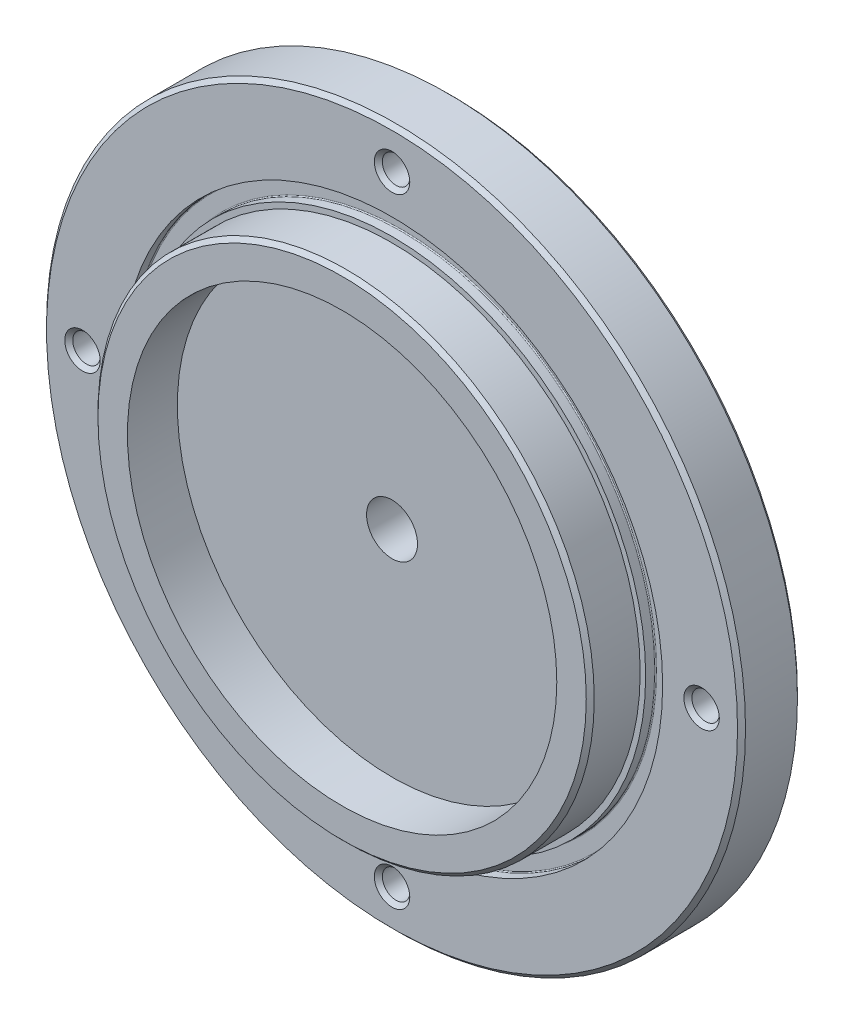
ISO-10303-21;
HEADER;
FILE_DESCRIPTION(('STEP AP214'),'2;1');
FILE_NAME('part.step','',(''),(''),'','','');
FILE_SCHEMA(('AUTOMOTIVE_DESIGN { 1 0 10303 214 1 1 1 1 }'));
ENDSEC;
DATA;
#1=APPLICATION_CONTEXT('core data for automotive mechanical design processes');
#2=APPLICATION_PROTOCOL_DEFINITION('international standard','automotive_design',2000,#1);
#3=PRODUCT_CONTEXT('',#1,'mechanical');
#4=PRODUCT('Part','Part','',(#3));
#5=PRODUCT_RELATED_PRODUCT_CATEGORY('part','',(#4));
#6=PRODUCT_DEFINITION_FORMATION('','',#4);
#7=PRODUCT_DEFINITION_CONTEXT('part definition',#1,'design');
#8=PRODUCT_DEFINITION('design','',#6,#7);
#9=PRODUCT_DEFINITION_SHAPE('','',#8);
#10=(LENGTH_UNIT() NAMED_UNIT(*) SI_UNIT(.MILLI.,.METRE.));
#11=(NAMED_UNIT(*) PLANE_ANGLE_UNIT() SI_UNIT($,.RADIAN.));
#12=(NAMED_UNIT(*) SI_UNIT($,.STERADIAN.) SOLID_ANGLE_UNIT());
#13=UNCERTAINTY_MEASURE_WITH_UNIT(LENGTH_MEASURE(1.E-05),#10,'distance_accuracy_value','');
#14=(GEOMETRIC_REPRESENTATION_CONTEXT(3) GLOBAL_UNCERTAINTY_ASSIGNED_CONTEXT((#13)) GLOBAL_UNIT_ASSIGNED_CONTEXT((#10,
#11,#12)) REPRESENTATION_CONTEXT('',''));
#15=CARTESIAN_POINT('',(0.,0.,0.));
#16=DIRECTION('',(0.,0.,1.));
#17=DIRECTION('',(1.,0.,0.));
#18=AXIS2_PLACEMENT_3D('',#15,#16,#17);
#19=CARTESIAN_POINT('',(0.,0.,-12.));
#20=DIRECTION('',(0.,0.,1.));
#21=DIRECTION('',(1.,0.,0.));
#22=AXIS2_PLACEMENT_3D('',#19,#20,#21);
#23=PLANE('',#22);
#24=CARTESIAN_POINT('',(-62.,4.55722116480689E-13,-12.));
#25=DIRECTION('',(0.,0.,1.));
#26=DIRECTION('',(1.,0.,0.));
#27=AXIS2_PLACEMENT_3D('',#24,#25,#26);
#28=CIRCLE('',#27,3.54999999999997);
#29=CARTESIAN_POINT('',(-58.45,4.55722116480689E-13,-12.));
#30=VERTEX_POINT('',#29);
#31=EDGE_CURVE('E55',#30,#30,#28,.T.);
#32=ORIENTED_EDGE('',*,*,#31,.T.);
#33=EDGE_LOOP('',(#32));
#34=FACE_BOUND('',#33,.T.);
#35=CARTESIAN_POINT('',(0.,-62.,-12.));
#36=DIRECTION('',(0.,0.,1.));
#37=DIRECTION('',(1.,0.,0.));
#38=AXIS2_PLACEMENT_3D('',#35,#36,#37);
#39=CIRCLE('',#38,3.54999999999997);
#40=CARTESIAN_POINT('',(3.54999999999997,-62.,-12.));
#41=VERTEX_POINT('',#40);
#42=EDGE_CURVE('E59',#41,#41,#39,.T.);
#43=ORIENTED_EDGE('',*,*,#42,.T.);
#44=EDGE_LOOP('',(#43));
#45=FACE_BOUND('',#44,.T.);
#46=CARTESIAN_POINT('',(62.,0.,-12.));
#47=DIRECTION('',(0.,0.,1.));
#48=DIRECTION('',(1.,0.,0.));
#49=AXIS2_PLACEMENT_3D('',#46,#47,#48);
#50=CIRCLE('',#49,3.54999999999997);
#51=CARTESIAN_POINT('',(65.55,0.,-12.));
#52=VERTEX_POINT('',#51);
#53=EDGE_CURVE('E64',#52,#52,#50,.T.);
#54=ORIENTED_EDGE('',*,*,#53,.T.);
#55=EDGE_LOOP('',(#54));
#56=FACE_BOUND('',#55,.T.);
#57=CARTESIAN_POINT('',(0.,62.,-12.));
#58=DIRECTION('',(0.,0.,1.));
#59=DIRECTION('',(1.,0.,0.));
#60=AXIS2_PLACEMENT_3D('',#57,#58,#59);
#61=CIRCLE('',#60,3.54999999999997);
#62=CARTESIAN_POINT('',(3.54999999999997,62.,-12.));
#63=VERTEX_POINT('',#62);
#64=EDGE_CURVE('E67',#63,#63,#61,.T.);
#65=ORIENTED_EDGE('',*,*,#64,.T.);
#66=EDGE_LOOP('',(#65));
#67=FACE_BOUND('',#66,.T.);
#68=CARTESIAN_POINT('',(0.,0.,-12.));
#69=DIRECTION('',(0.,0.,1.));
#70=DIRECTION('',(1.,0.,0.));
#71=AXIS2_PLACEMENT_3D('',#68,#69,#70);
#72=CIRCLE('',#71,69.2);
#73=CARTESIAN_POINT('',(69.2,0.,-12.));
#74=VERTEX_POINT('',#73);
#75=EDGE_CURVE('E70',#74,#74,#72,.F.);
#76=ORIENTED_EDGE('',*,*,#75,.T.);
#77=EDGE_LOOP('',(#76));
#78=FACE_BOUND('',#77,.T.);
#79=CARTESIAN_POINT('',(0.,0.,-12.));
#80=DIRECTION('',(0.,0.,-1.));
#81=DIRECTION('',(-1.,0.,0.));
#82=AXIS2_PLACEMENT_3D('',#79,#80,#81);
#83=CIRCLE('',#82,5.1);
#84=CARTESIAN_POINT('',(-5.1,0.,-12.));
#85=VERTEX_POINT('',#84);
#86=EDGE_CURVE('E148',#85,#85,#83,.T.);
#87=ORIENTED_EDGE('',*,*,#86,.F.);
#88=EDGE_LOOP('',(#87));
#89=FACE_BOUND('',#88,.T.);
#90=ADVANCED_FACE('F43',(#34,#45,#56,#67,#78,#89),#23,.F.);
#91=CARTESIAN_POINT('',(0.,0.,0.));
#92=DIRECTION('',(0.,0.,1.));
#93=DIRECTION('',(1.,0.,0.));
#94=AXIS2_PLACEMENT_3D('',#91,#92,#93);
#95=PLANE('',#94);
#96=CARTESIAN_POINT('',(0.,0.,0.));
#97=DIRECTION('',(0.,0.,1.));
#98=DIRECTION('',(1.,0.,0.));
#99=AXIS2_PLACEMENT_3D('',#96,#97,#98);
#100=CIRCLE('',#99,49.7);
#101=CARTESIAN_POINT('',(49.7,0.,0.));
#102=VERTEX_POINT('',#101);
#103=EDGE_CURVE('E133',#102,#102,#100,.T.);
#104=ORIENTED_EDGE('',*,*,#103,.F.);
#105=EDGE_LOOP('',(#104));
#106=FACE_BOUND('',#105,.T.);
#107=CARTESIAN_POINT('',(0.,0.,0.));
#108=DIRECTION('',(0.,0.,1.));
#109=DIRECTION('',(1.,0.,0.));
#110=AXIS2_PLACEMENT_3D('',#107,#108,#109);
#111=CIRCLE('',#110,50.8);
#112=CARTESIAN_POINT('',(50.8,0.,0.));
#113=VERTEX_POINT('',#112);
#114=EDGE_CURVE('E142',#113,#113,#111,.T.);
#115=ORIENTED_EDGE('',*,*,#114,.T.);
#116=EDGE_LOOP('',(#115));
#117=FACE_BOUND('',#116,.T.);
#118=ADVANCED_FACE('F155',(#106,#117),#95,.T.);
#119=CARTESIAN_POINT('',(0.,0.,10.));
#120=DIRECTION('',(0.,0.,1.));
#121=DIRECTION('',(1.,0.,0.));
#122=AXIS2_PLACEMENT_3D('',#119,#120,#121);
#123=PLANE('',#122);
#124=CARTESIAN_POINT('',(0.,0.,10.));
#125=DIRECTION('',(0.,0.,1.));
#126=DIRECTION('',(1.,0.,0.));
#127=AXIS2_PLACEMENT_3D('',#124,#125,#126);
#128=CIRCLE('',#127,48.9);
#129=CARTESIAN_POINT('',(48.9,0.,10.));
#130=VERTEX_POINT('',#129);
#131=EDGE_CURVE('E127',#130,#130,#128,.T.);
#132=ORIENTED_EDGE('',*,*,#131,.T.);
#133=EDGE_LOOP('',(#132));
#134=FACE_BOUND('',#133,.T.);
#135=CARTESIAN_POINT('',(0.,0.,10.));
#136=DIRECTION('',(0.,0.,1.));
#137=DIRECTION('',(1.,0.,0.));
#138=AXIS2_PLACEMENT_3D('',#135,#136,#137);
#139=CIRCLE('',#138,43.);
#140=CARTESIAN_POINT('',(43.,0.,10.));
#141=VERTEX_POINT('',#140);
#142=EDGE_CURVE('E136',#141,#141,#139,.T.);
#143=ORIENTED_EDGE('',*,*,#142,.F.);
#144=EDGE_LOOP('',(#143));
#145=FACE_BOUND('',#144,.T.);
#146=ADVANCED_FACE('F163',(#134,#145),#123,.T.);
#147=CARTESIAN_POINT('',(0.,0.,10.));
#148=DIRECTION('',(0.,0.,-1.));
#149=DIRECTION('',(-1.,0.,0.));
#150=AXIS2_PLACEMENT_3D('',#147,#148,#149);
#151=CYLINDRICAL_SURFACE('',#150,49.7);
#152=CARTESIAN_POINT('',(0.,0.,9.2));
#153=DIRECTION('',(0.,0.,1.));
#154=DIRECTION('',(1.,0.,0.));
#155=AXIS2_PLACEMENT_3D('',#152,#153,#154);
#156=CIRCLE('',#155,49.7);
#157=CARTESIAN_POINT('',(49.7,0.,9.2));
#158=VERTEX_POINT('',#157);
#159=EDGE_CURVE('E124',#158,#158,#156,.F.);
#160=ORIENTED_EDGE('',*,*,#159,.T.);
#161=EDGE_LOOP('',(#160));
#162=FACE_BOUND('',#161,.T.);
#163=ORIENTED_EDGE('',*,*,#103,.T.);
#164=EDGE_LOOP('',(#163));
#165=FACE_BOUND('',#164,.T.);
#166=ADVANCED_FACE('F170',(#162,#165),#151,.T.);
#167=CARTESIAN_POINT('',(0.,0.,10.));
#168=DIRECTION('',(0.,0.,-1.));
#169=DIRECTION('',(-1.,0.,0.));
#170=AXIS2_PLACEMENT_3D('',#167,#168,#169);
#171=CYLINDRICAL_SURFACE('',#170,43.);
#172=ORIENTED_EDGE('',*,*,#142,.T.);
#173=EDGE_LOOP('',(#172));
#174=FACE_BOUND('',#173,.T.);
#175=CARTESIAN_POINT('',(0.,0.,0.));
#176=DIRECTION('',(0.,0.,1.));
#177=DIRECTION('',(1.,0.,0.));
#178=AXIS2_PLACEMENT_3D('',#175,#176,#177);
#179=CIRCLE('',#178,43.);
#180=CARTESIAN_POINT('',(43.,0.,0.));
#181=VERTEX_POINT('',#180);
#182=EDGE_CURVE('E130',#181,#181,#179,.F.);
#183=ORIENTED_EDGE('',*,*,#182,.T.);
#184=EDGE_LOOP('',(#183));
#185=FACE_BOUND('',#184,.T.);
#186=ADVANCED_FACE('F279',(#174,#185),#171,.F.);
#187=CARTESIAN_POINT('',(0.,0.,0.));
#188=DIRECTION('',(0.,0.,1.));
#189=DIRECTION('',(1.,0.,0.));
#190=AXIS2_PLACEMENT_3D('',#187,#188,#189);
#191=CIRCLE('',#190,5.1);
#192=CARTESIAN_POINT('',(5.1,0.,0.));
#193=VERTEX_POINT('',#192);
#194=EDGE_CURVE('E145',#193,#193,#191,.T.);
#195=ORIENTED_EDGE('',*,*,#194,.F.);
#196=EDGE_LOOP('',(#195));
#197=FACE_BOUND('',#196,.T.);
#198=ORIENTED_EDGE('',*,*,#182,.F.);
#199=EDGE_LOOP('',(#198));
#200=FACE_BOUND('',#199,.T.);
#201=ADVANCED_FACE('F166',(#197,#200),#95,.T.);
#202=CARTESIAN_POINT('',(0.,0.,10.));
#203=DIRECTION('',(0.,0.,-1.));
#204=DIRECTION('',(-1.,0.,0.));
#205=AXIS2_PLACEMENT_3D('',#202,#203,#204);
#206=CONICAL_SURFACE('',#205,48.9,0.785398163397431);
#207=ORIENTED_EDGE('',*,*,#159,.F.);
#208=EDGE_LOOP('',(#207));
#209=FACE_BOUND('',#208,.T.);
#210=ORIENTED_EDGE('',*,*,#131,.F.);
#211=EDGE_LOOP('',(#210));
#212=FACE_BOUND('',#211,.T.);
#213=ADVANCED_FACE('F181',(#209,#212),#206,.T.);
#214=CARTESIAN_POINT('',(0.,0.,-2.));
#215=DIRECTION('',(0.,0.,1.));
#216=DIRECTION('',(1.,0.,0.));
#217=AXIS2_PLACEMENT_3D('',#214,#215,#216);
#218=CYLINDRICAL_SURFACE('',#217,54.2);
#219=CARTESIAN_POINT('',(0.,0.,-1.8));
#220=DIRECTION('',(0.,0.,1.));
#221=DIRECTION('',(1.,0.,0.));
#222=AXIS2_PLACEMENT_3D('',#219,#220,#221);
#223=CIRCLE('',#222,54.2);
#224=CARTESIAN_POINT('',(54.2,0.,-1.8));
#225=VERTEX_POINT('',#224);
#226=EDGE_CURVE('E115',#225,#225,#223,.F.);
#227=ORIENTED_EDGE('',*,*,#226,.T.);
#228=EDGE_LOOP('',(#227));
#229=FACE_BOUND('',#228,.T.);
#230=CARTESIAN_POINT('',(0.,0.,0.));
#231=DIRECTION('',(0.,0.,1.));
#232=DIRECTION('',(1.,0.,0.));
#233=AXIS2_PLACEMENT_3D('',#230,#231,#232);
#234=CIRCLE('',#233,54.2);
#235=CARTESIAN_POINT('',(54.2,0.,0.));
#236=VERTEX_POINT('',#235);
#237=EDGE_CURVE('E139',#236,#236,#234,.T.);
#238=ORIENTED_EDGE('',*,*,#237,.T.);
#239=EDGE_LOOP('',(#238));
#240=FACE_BOUND('',#239,.T.);
#241=ADVANCED_FACE('F187',(#229,#240),#218,.F.);
#242=CARTESIAN_POINT('',(0.,0.,-2.));
#243=DIRECTION('',(0.,0.,1.));
#244=DIRECTION('',(1.,0.,0.));
#245=AXIS2_PLACEMENT_3D('',#242,#243,#244);
#246=PLANE('',#245);
#247=CARTESIAN_POINT('',(0.,0.,-2.));
#248=DIRECTION('',(0.,0.,1.));
#249=DIRECTION('',(1.,0.,0.));
#250=AXIS2_PLACEMENT_3D('',#247,#248,#249);
#251=CIRCLE('',#250,54.);
#252=CARTESIAN_POINT('',(54.,0.,-2.));
#253=VERTEX_POINT('',#252);
#254=EDGE_CURVE('E118',#253,#253,#251,.T.);
#255=ORIENTED_EDGE('',*,*,#254,.T.);
#256=EDGE_LOOP('',(#255));
#257=FACE_BOUND('',#256,.T.);
#258=CARTESIAN_POINT('',(0.,0.,-2.));
#259=DIRECTION('',(0.,0.,1.));
#260=DIRECTION('',(1.,0.,0.));
#261=AXIS2_PLACEMENT_3D('',#258,#259,#260);
#262=CIRCLE('',#261,51.);
#263=CARTESIAN_POINT('',(51.,0.,-2.));
#264=VERTEX_POINT('',#263);
#265=EDGE_CURVE('E121',#264,#264,#262,.F.);
#266=ORIENTED_EDGE('',*,*,#265,.T.);
#267=EDGE_LOOP('',(#266));
#268=FACE_BOUND('',#267,.T.);
#269=ADVANCED_FACE('F269',(#257,#268),#246,.T.);
#270=CARTESIAN_POINT('',(0.,0.,-2.));
#271=DIRECTION('',(0.,0.,1.));
#272=DIRECTION('',(1.,0.,0.));
#273=AXIS2_PLACEMENT_3D('',#270,#271,#272);
#274=CYLINDRICAL_SURFACE('',#273,50.8);
#275=CARTESIAN_POINT('',(0.,0.,-1.8));
#276=DIRECTION('',(0.,0.,1.));
#277=DIRECTION('',(1.,0.,0.));
#278=AXIS2_PLACEMENT_3D('',#275,#276,#277);
#279=CIRCLE('',#278,50.8);
#280=CARTESIAN_POINT('',(50.8,0.,-1.8));
#281=VERTEX_POINT('',#280);
#282=EDGE_CURVE('E112',#281,#281,#279,.T.);
#283=ORIENTED_EDGE('',*,*,#282,.T.);
#284=EDGE_LOOP('',(#283));
#285=FACE_BOUND('',#284,.T.);
#286=ORIENTED_EDGE('',*,*,#114,.F.);
#287=EDGE_LOOP('',(#286));
#288=FACE_BOUND('',#287,.T.);
#289=ADVANCED_FACE('F179',(#285,#288),#274,.T.);
#290=CARTESIAN_POINT('',(0.,0.,-12.));
#291=DIRECTION('',(0.,0.,1.));
#292=DIRECTION('',(1.,0.,0.));
#293=AXIS2_PLACEMENT_3D('',#290,#291,#292);
#294=CYLINDRICAL_SURFACE('',#293,70.);
#295=CARTESIAN_POINT('',(0.,0.,-0.799999999999967));
#296=DIRECTION('',(0.,0.,1.));
#297=DIRECTION('',(1.,0.,0.));
#298=AXIS2_PLACEMENT_3D('',#295,#296,#297);
#299=CIRCLE('',#298,70.);
#300=CARTESIAN_POINT('',(70.,0.,-0.799999999999967));
#301=VERTEX_POINT('',#300);
#302=EDGE_CURVE('E10',#301,#301,#299,.F.);
#303=ORIENTED_EDGE('',*,*,#302,.T.);
#304=EDGE_LOOP('',(#303));
#305=FACE_BOUND('',#304,.T.);
#306=CARTESIAN_POINT('',(0.,0.,-11.2));
#307=DIRECTION('',(0.,0.,1.));
#308=DIRECTION('',(1.,0.,0.));
#309=AXIS2_PLACEMENT_3D('',#306,#307,#308);
#310=CIRCLE('',#309,70.);
#311=CARTESIAN_POINT('',(70.,0.,-11.2));
#312=VERTEX_POINT('',#311);
#313=EDGE_CURVE('E51',#312,#312,#310,.T.);
#314=ORIENTED_EDGE('',*,*,#313,.T.);
#315=EDGE_LOOP('',(#314));
#316=FACE_BOUND('',#315,.T.);
#317=ADVANCED_FACE('F175',(#305,#316),#294,.T.);
#318=CARTESIAN_POINT('',(0.,-62.,0.));
#319=DIRECTION('',(0.,0.,1.));
#320=DIRECTION('',(1.,0.,0.));
#321=AXIS2_PLACEMENT_3D('',#318,#319,#320);
#322=CIRCLE('',#321,3.55);
#323=CARTESIAN_POINT('',(3.55,-62.,0.));
#324=VERTEX_POINT('',#323);
#325=EDGE_CURVE('E91',#324,#324,#322,.F.);
#326=ORIENTED_EDGE('',*,*,#325,.T.);
#327=EDGE_LOOP('',(#326));
#328=FACE_BOUND('',#327,.T.);
#329=CARTESIAN_POINT('',(62.,0.,0.));
#330=DIRECTION('',(0.,0.,1.));
#331=DIRECTION('',(1.,0.,0.));
#332=AXIS2_PLACEMENT_3D('',#329,#330,#331);
#333=CIRCLE('',#332,3.55);
#334=CARTESIAN_POINT('',(65.55,0.,0.));
#335=VERTEX_POINT('',#334);
#336=EDGE_CURVE('E94',#335,#335,#333,.F.);
#337=ORIENTED_EDGE('',*,*,#336,.T.);
#338=EDGE_LOOP('',(#337));
#339=FACE_BOUND('',#338,.T.);
#340=CARTESIAN_POINT('',(-62.,4.55722116480689E-13,0.));
#341=DIRECTION('',(0.,0.,1.));
#342=DIRECTION('',(1.,0.,0.));
#343=AXIS2_PLACEMENT_3D('',#340,#341,#342);
#344=CIRCLE('',#343,3.55);
#345=CARTESIAN_POINT('',(-58.45,4.55722116480689E-13,0.));
#346=VERTEX_POINT('',#345);
#347=EDGE_CURVE('E97',#346,#346,#344,.F.);
#348=ORIENTED_EDGE('',*,*,#347,.T.);
#349=EDGE_LOOP('',(#348));
#350=FACE_BOUND('',#349,.T.);
#351=CARTESIAN_POINT('',(0.,62.,0.));
#352=DIRECTION('',(0.,0.,1.));
#353=DIRECTION('',(1.,0.,0.));
#354=AXIS2_PLACEMENT_3D('',#351,#352,#353);
#355=CIRCLE('',#354,3.55);
#356=CARTESIAN_POINT('',(3.55,62.,0.));
#357=VERTEX_POINT('',#356);
#358=EDGE_CURVE('E100',#357,#357,#355,.F.);
#359=ORIENTED_EDGE('',*,*,#358,.T.);
#360=EDGE_LOOP('',(#359));
#361=FACE_BOUND('',#360,.T.);
#362=CARTESIAN_POINT('',(0.,0.,0.));
#363=DIRECTION('',(0.,0.,1.));
#364=DIRECTION('',(1.,0.,0.));
#365=AXIS2_PLACEMENT_3D('',#362,#363,#364);
#366=CIRCLE('',#365,69.2000000000001);
#367=CARTESIAN_POINT('',(69.2000000000001,0.,0.));
#368=VERTEX_POINT('',#367);
#369=EDGE_CURVE('E103',#368,#368,#366,.T.);
#370=ORIENTED_EDGE('',*,*,#369,.T.);
#371=EDGE_LOOP('',(#370));
#372=FACE_BOUND('',#371,.T.);
#373=ORIENTED_EDGE('',*,*,#237,.F.);
#374=EDGE_LOOP('',(#373));
#375=FACE_BOUND('',#374,.T.);
#376=ADVANCED_FACE('F167',(#328,#339,#350,#361,#372,#375),#95,.T.);
#377=CARTESIAN_POINT('',(0.,0.,-1.8));
#378=DIRECTION('',(0.,0.,1.));
#379=DIRECTION('',(1.,0.,0.));
#380=AXIS2_PLACEMENT_3D('',#377,#378,#379);
#381=TOROIDAL_SURFACE('',#380,54.,0.2);
#382=ORIENTED_EDGE('',*,*,#226,.F.);
#383=EDGE_LOOP('',(#382));
#384=FACE_BOUND('',#383,.T.);
#385=ORIENTED_EDGE('',*,*,#254,.F.);
#386=EDGE_LOOP('',(#385));
#387=FACE_BOUND('',#386,.T.);
#388=ADVANCED_FACE('F174',(#384,#387),#381,.F.);
#389=CARTESIAN_POINT('',(0.,0.,-1.8));
#390=DIRECTION('',(0.,0.,1.));
#391=DIRECTION('',(1.,0.,0.));
#392=AXIS2_PLACEMENT_3D('',#389,#390,#391);
#393=TOROIDAL_SURFACE('',#392,51.,0.2);
#394=ORIENTED_EDGE('',*,*,#265,.F.);
#395=EDGE_LOOP('',(#394));
#396=FACE_BOUND('',#395,.T.);
#397=ORIENTED_EDGE('',*,*,#282,.F.);
#398=EDGE_LOOP('',(#397));
#399=FACE_BOUND('',#398,.T.);
#400=ADVANCED_FACE('F191',(#396,#399),#393,.F.);
#401=CARTESIAN_POINT('',(-62.,4.55722116480689E-13,-12.));
#402=DIRECTION('',(0.,0.,-1.));
#403=DIRECTION('',(-1.,0.,0.));
#404=AXIS2_PLACEMENT_3D('',#401,#402,#403);
#405=CYLINDRICAL_SURFACE('',#404,2.74999999999999);
#406=CARTESIAN_POINT('',(-62.,4.55722116480689E-13,-0.800000000000016));
#407=DIRECTION('',(0.,0.,1.));
#408=DIRECTION('',(1.,0.,0.));
#409=AXIS2_PLACEMENT_3D('',#406,#407,#408);
#410=CIRCLE('',#409,2.74999999999999);
#411=CARTESIAN_POINT('',(-59.25,4.55722116480689E-13,-0.800000000000016));
#412=VERTEX_POINT('',#411);
#413=EDGE_CURVE('E79',#412,#412,#410,.T.);
#414=ORIENTED_EDGE('',*,*,#413,.T.);
#415=EDGE_LOOP('',(#414));
#416=FACE_BOUND('',#415,.T.);
#417=CARTESIAN_POINT('',(-62.,4.55722116480689E-13,-11.2));
#418=DIRECTION('',(0.,0.,1.));
#419=DIRECTION('',(1.,0.,0.));
#420=AXIS2_PLACEMENT_3D('',#417,#418,#419);
#421=CIRCLE('',#420,2.74999999999999);
#422=CARTESIAN_POINT('',(-59.25,4.55722116480689E-13,-11.2));
#423=VERTEX_POINT('',#422);
#424=EDGE_CURVE('E82',#423,#423,#421,.F.);
#425=ORIENTED_EDGE('',*,*,#424,.T.);
#426=EDGE_LOOP('',(#425));
#427=FACE_BOUND('',#426,.T.);
#428=ADVANCED_FACE('F195',(#416,#427),#405,.F.);
#429=CARTESIAN_POINT('',(0.,-62.,-12.));
#430=DIRECTION('',(0.,0.,-1.));
#431=DIRECTION('',(-1.,0.,0.));
#432=AXIS2_PLACEMENT_3D('',#429,#430,#431);
#433=CYLINDRICAL_SURFACE('',#432,2.74999999999999);
#434=CARTESIAN_POINT('',(0.,-62.,-0.800000000000014));
#435=DIRECTION('',(0.,0.,1.));
#436=DIRECTION('',(1.,0.,0.));
#437=AXIS2_PLACEMENT_3D('',#434,#435,#436);
#438=CIRCLE('',#437,2.74999999999999);
#439=CARTESIAN_POINT('',(2.74999999999999,-62.,-0.800000000000014));
#440=VERTEX_POINT('',#439);
#441=EDGE_CURVE('E106',#440,#440,#438,.T.);
#442=ORIENTED_EDGE('',*,*,#441,.T.);
#443=EDGE_LOOP('',(#442));
#444=FACE_BOUND('',#443,.T.);
#445=CARTESIAN_POINT('',(0.,-62.,-11.2));
#446=DIRECTION('',(0.,0.,1.));
#447=DIRECTION('',(1.,0.,0.));
#448=AXIS2_PLACEMENT_3D('',#445,#446,#447);
#449=CIRCLE('',#448,2.74999999999999);
#450=CARTESIAN_POINT('',(2.74999999999999,-62.,-11.2));
#451=VERTEX_POINT('',#450);
#452=EDGE_CURVE('E109',#451,#451,#449,.F.);
#453=ORIENTED_EDGE('',*,*,#452,.T.);
#454=EDGE_LOOP('',(#453));
#455=FACE_BOUND('',#454,.T.);
#456=ADVANCED_FACE('F311',(#444,#455),#433,.F.);
#457=CARTESIAN_POINT('',(62.,0.,-12.));
#458=DIRECTION('',(0.,0.,-1.));
#459=DIRECTION('',(-1.,0.,0.));
#460=AXIS2_PLACEMENT_3D('',#457,#458,#459);
#461=CYLINDRICAL_SURFACE('',#460,2.75);
#462=CARTESIAN_POINT('',(62.,0.,-0.800000000000012));
#463=DIRECTION('',(0.,0.,1.));
#464=DIRECTION('',(1.,0.,0.));
#465=AXIS2_PLACEMENT_3D('',#462,#463,#464);
#466=CIRCLE('',#465,2.75);
#467=CARTESIAN_POINT('',(64.75,0.,-0.800000000000012));
#468=VERTEX_POINT('',#467);
#469=EDGE_CURVE('E85',#468,#468,#466,.T.);
#470=ORIENTED_EDGE('',*,*,#469,.T.);
#471=EDGE_LOOP('',(#470));
#472=FACE_BOUND('',#471,.T.);
#473=CARTESIAN_POINT('',(62.,0.,-11.2));
#474=DIRECTION('',(0.,0.,1.));
#475=DIRECTION('',(1.,0.,0.));
#476=AXIS2_PLACEMENT_3D('',#473,#474,#475);
#477=CIRCLE('',#476,2.75);
#478=CARTESIAN_POINT('',(64.75,0.,-11.2));
#479=VERTEX_POINT('',#478);
#480=EDGE_CURVE('E88',#479,#479,#477,.F.);
#481=ORIENTED_EDGE('',*,*,#480,.T.);
#482=EDGE_LOOP('',(#481));
#483=FACE_BOUND('',#482,.T.);
#484=ADVANCED_FACE('F307',(#472,#483),#461,.F.);
#485=CARTESIAN_POINT('',(0.,62.,-12.));
#486=DIRECTION('',(0.,0.,-1.));
#487=DIRECTION('',(-1.,0.,0.));
#488=AXIS2_PLACEMENT_3D('',#485,#486,#487);
#489=CYLINDRICAL_SURFACE('',#488,2.74999999999999);
#490=CARTESIAN_POINT('',(0.,62.,-0.800000000000014));
#491=DIRECTION('',(0.,0.,1.));
#492=DIRECTION('',(1.,0.,0.));
#493=AXIS2_PLACEMENT_3D('',#490,#491,#492);
#494=CIRCLE('',#493,2.74999999999999);
#495=CARTESIAN_POINT('',(2.74999999999999,62.,-0.800000000000014));
#496=VERTEX_POINT('',#495);
#497=EDGE_CURVE('E73',#496,#496,#494,.T.);
#498=ORIENTED_EDGE('',*,*,#497,.T.);
#499=EDGE_LOOP('',(#498));
#500=FACE_BOUND('',#499,.T.);
#501=CARTESIAN_POINT('',(0.,62.,-11.2));
#502=DIRECTION('',(0.,0.,1.));
#503=DIRECTION('',(1.,0.,0.));
#504=AXIS2_PLACEMENT_3D('',#501,#502,#503);
#505=CIRCLE('',#504,2.74999999999999);
#506=CARTESIAN_POINT('',(2.74999999999999,62.,-11.2));
#507=VERTEX_POINT('',#506);
#508=EDGE_CURVE('E76',#507,#507,#505,.F.);
#509=ORIENTED_EDGE('',*,*,#508,.T.);
#510=EDGE_LOOP('',(#509));
#511=FACE_BOUND('',#510,.T.);
#512=ADVANCED_FACE('F204',(#500,#511),#489,.F.);
#513=CARTESIAN_POINT('',(0.,-62.,-0.800000000000014));
#514=DIRECTION('',(0.,0.,1.));
#515=DIRECTION('',(1.,0.,0.));
#516=AXIS2_PLACEMENT_3D('',#513,#514,#515);
#517=CONICAL_SURFACE('',#516,2.74999999999999,0.785398163397443);
#518=ORIENTED_EDGE('',*,*,#325,.F.);
#519=EDGE_LOOP('',(#518));
#520=FACE_BOUND('',#519,.T.);
#521=ORIENTED_EDGE('',*,*,#441,.F.);
#522=EDGE_LOOP('',(#521));
#523=FACE_BOUND('',#522,.T.);
#524=ADVANCED_FACE('F197',(#520,#523),#517,.F.);
#525=CARTESIAN_POINT('',(62.,0.,-0.800000000000012));
#526=DIRECTION('',(0.,0.,1.));
#527=DIRECTION('',(1.,0.,0.));
#528=AXIS2_PLACEMENT_3D('',#525,#526,#527);
#529=CONICAL_SURFACE('',#528,2.75,0.785398163397442);
#530=ORIENTED_EDGE('',*,*,#336,.F.);
#531=EDGE_LOOP('',(#530));
#532=FACE_BOUND('',#531,.T.);
#533=ORIENTED_EDGE('',*,*,#469,.F.);
#534=EDGE_LOOP('',(#533));
#535=FACE_BOUND('',#534,.T.);
#536=ADVANCED_FACE('F203',(#532,#535),#529,.F.);
#537=CARTESIAN_POINT('',(-62.,4.55722116480689E-13,-0.800000000000016));
#538=DIRECTION('',(0.,0.,1.));
#539=DIRECTION('',(1.,0.,0.));
#540=AXIS2_PLACEMENT_3D('',#537,#538,#539);
#541=CONICAL_SURFACE('',#540,2.74999999999999,0.785398163397442);
#542=ORIENTED_EDGE('',*,*,#347,.F.);
#543=EDGE_LOOP('',(#542));
#544=FACE_BOUND('',#543,.T.);
#545=ORIENTED_EDGE('',*,*,#413,.F.);
#546=EDGE_LOOP('',(#545));
#547=FACE_BOUND('',#546,.T.);
#548=ADVANCED_FACE('F211',(#544,#547),#541,.F.);
#549=CARTESIAN_POINT('',(0.,62.,-0.800000000000014));
#550=DIRECTION('',(0.,0.,1.));
#551=DIRECTION('',(1.,0.,0.));
#552=AXIS2_PLACEMENT_3D('',#549,#550,#551);
#553=CONICAL_SURFACE('',#552,2.74999999999999,0.785398163397443);
#554=ORIENTED_EDGE('',*,*,#358,.F.);
#555=EDGE_LOOP('',(#554));
#556=FACE_BOUND('',#555,.T.);
#557=ORIENTED_EDGE('',*,*,#497,.F.);
#558=EDGE_LOOP('',(#557));
#559=FACE_BOUND('',#558,.T.);
#560=ADVANCED_FACE('F218',(#556,#559),#553,.F.);
#561=CARTESIAN_POINT('',(-62.,4.55722116480689E-13,-11.2));
#562=DIRECTION('',(0.,0.,-1.));
#563=DIRECTION('',(-1.,0.,0.));
#564=AXIS2_PLACEMENT_3D('',#561,#562,#563);
#565=CONICAL_SURFACE('',#564,2.74999999999999,0.785398163397457);
#566=ORIENTED_EDGE('',*,*,#31,.F.);
#567=EDGE_LOOP('',(#566));
#568=FACE_BOUND('',#567,.T.);
#569=ORIENTED_EDGE('',*,*,#424,.F.);
#570=EDGE_LOOP('',(#569));
#571=FACE_BOUND('',#570,.T.);
#572=ADVANCED_FACE('F225',(#568,#571),#565,.F.);
#573=CARTESIAN_POINT('',(0.,-62.,-11.2));
#574=DIRECTION('',(0.,0.,-1.));
#575=DIRECTION('',(-1.,0.,0.));
#576=AXIS2_PLACEMENT_3D('',#573,#574,#575);
#577=CONICAL_SURFACE('',#576,2.74999999999999,0.785398163397457);
#578=ORIENTED_EDGE('',*,*,#42,.F.);
#579=EDGE_LOOP('',(#578));
#580=FACE_BOUND('',#579,.T.);
#581=ORIENTED_EDGE('',*,*,#452,.F.);
#582=EDGE_LOOP('',(#581));
#583=FACE_BOUND('',#582,.T.);
#584=ADVANCED_FACE('F232',(#580,#583),#577,.F.);
#585=CARTESIAN_POINT('',(62.,0.,-11.2));
#586=DIRECTION('',(0.,0.,-1.));
#587=DIRECTION('',(-1.,0.,0.));
#588=AXIS2_PLACEMENT_3D('',#585,#586,#587);
#589=CONICAL_SURFACE('',#588,2.75,0.785398163397457);
#590=ORIENTED_EDGE('',*,*,#53,.F.);
#591=EDGE_LOOP('',(#590));
#592=FACE_BOUND('',#591,.T.);
#593=ORIENTED_EDGE('',*,*,#480,.F.);
#594=EDGE_LOOP('',(#593));
#595=FACE_BOUND('',#594,.T.);
#596=ADVANCED_FACE('F239',(#592,#595),#589,.F.);
#597=CARTESIAN_POINT('',(0.,62.,-11.2));
#598=DIRECTION('',(0.,0.,-1.));
#599=DIRECTION('',(-1.,0.,0.));
#600=AXIS2_PLACEMENT_3D('',#597,#598,#599);
#601=CONICAL_SURFACE('',#600,2.74999999999999,0.785398163397457);
#602=ORIENTED_EDGE('',*,*,#64,.F.);
#603=EDGE_LOOP('',(#602));
#604=FACE_BOUND('',#603,.T.);
#605=ORIENTED_EDGE('',*,*,#508,.F.);
#606=EDGE_LOOP('',(#605));
#607=FACE_BOUND('',#606,.T.);
#608=ADVANCED_FACE('F246',(#604,#607),#601,.F.);
#609=CARTESIAN_POINT('',(0.,0.,0.));
#610=DIRECTION('',(0.,0.,-1.));
#611=DIRECTION('',(-1.,0.,0.));
#612=AXIS2_PLACEMENT_3D('',#609,#610,#611);
#613=CONICAL_SURFACE('',#612,69.2000000000001,0.78539816339744);
#614=ORIENTED_EDGE('',*,*,#302,.F.);
#615=EDGE_LOOP('',(#614));
#616=FACE_BOUND('',#615,.T.);
#617=ORIENTED_EDGE('',*,*,#369,.F.);
#618=EDGE_LOOP('',(#617));
#619=FACE_BOUND('',#618,.T.);
#620=ADVANCED_FACE('F252',(#616,#619),#613,.T.);
#621=CARTESIAN_POINT('',(0.,0.,-11.2));
#622=DIRECTION('',(0.,0.,1.));
#623=DIRECTION('',(1.,0.,0.));
#624=AXIS2_PLACEMENT_3D('',#621,#622,#623);
#625=CONICAL_SURFACE('',#624,70.,0.785398163397448);
#626=ORIENTED_EDGE('',*,*,#75,.F.);
#627=EDGE_LOOP('',(#626));
#628=FACE_BOUND('',#627,.T.);
#629=ORIENTED_EDGE('',*,*,#313,.F.);
#630=EDGE_LOOP('',(#629));
#631=FACE_BOUND('',#630,.T.);
#632=ADVANCED_FACE('F46',(#628,#631),#625,.T.);
#633=CARTESIAN_POINT('',(0.,0.,-12.));
#634=DIRECTION('',(0.,0.,-1.));
#635=DIRECTION('',(-1.,0.,0.));
#636=AXIS2_PLACEMENT_3D('',#633,#634,#635);
#637=CYLINDRICAL_SURFACE('',#636,5.1);
#638=ORIENTED_EDGE('',*,*,#194,.T.);
#639=EDGE_LOOP('',(#638));
#640=FACE_BOUND('',#639,.T.);
#641=ORIENTED_EDGE('',*,*,#86,.T.);
#642=EDGE_LOOP('',(#641));
#643=FACE_BOUND('',#642,.T.);
#644=ADVANCED_FACE('F152',(#640,#643),#637,.F.);
#645=CLOSED_SHELL('',(#90,#118,#146,#166,#186,#201,#213,#241,#269,#289,#317,#376,#388,#400,#428,
#456,#484,#512,#524,#536,#548,#560,#572,#584,#596,#608,#620,#632,#644));
#646=MANIFOLD_SOLID_BREP('B2',#645);
#647=ADVANCED_BREP_SHAPE_REPRESENTATION('',(#18,#646),#14);
#648=SHAPE_DEFINITION_REPRESENTATION(#9,#647);
ENDSEC;
END-ISO-10303-21;
